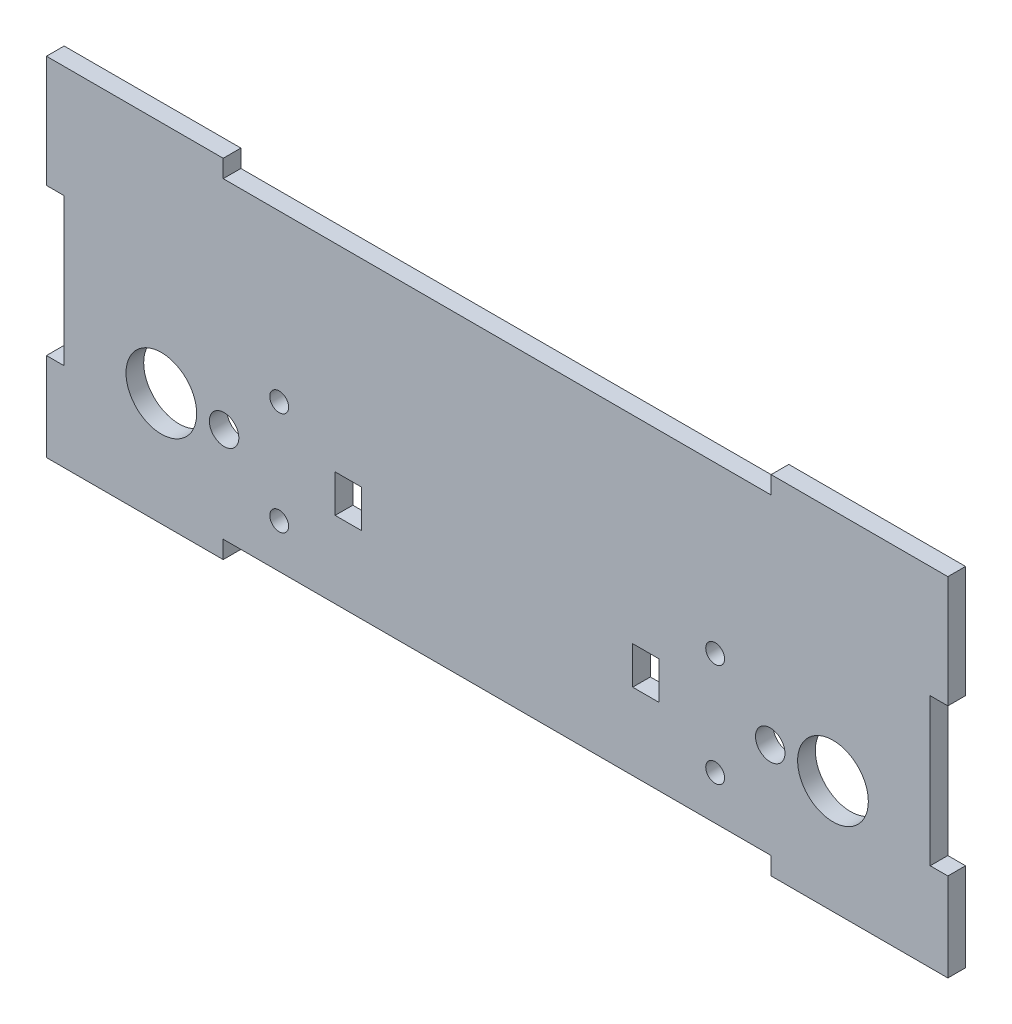
ISO-10303-21;
HEADER;
FILE_DESCRIPTION(('STEP AP214'),'2;1');
FILE_NAME('part.step','',(''),(''),'','','');
FILE_SCHEMA(('AUTOMOTIVE_DESIGN { 1 0 10303 214 1 1 1 1 }'));
ENDSEC;
DATA;
#1=APPLICATION_CONTEXT('core data for automotive mechanical design processes');
#2=APPLICATION_PROTOCOL_DEFINITION('international standard','automotive_design',2000,#1);
#3=PRODUCT_CONTEXT('',#1,'mechanical');
#4=PRODUCT('Part','Part','',(#3));
#5=PRODUCT_RELATED_PRODUCT_CATEGORY('part','',(#4));
#6=PRODUCT_DEFINITION_FORMATION('','',#4);
#7=PRODUCT_DEFINITION_CONTEXT('part definition',#1,'design');
#8=PRODUCT_DEFINITION('design','',#6,#7);
#9=PRODUCT_DEFINITION_SHAPE('','',#8);
#10=(LENGTH_UNIT() NAMED_UNIT(*) SI_UNIT(.MILLI.,.METRE.));
#11=(NAMED_UNIT(*) PLANE_ANGLE_UNIT() SI_UNIT($,.RADIAN.));
#12=(NAMED_UNIT(*) SI_UNIT($,.STERADIAN.) SOLID_ANGLE_UNIT());
#13=UNCERTAINTY_MEASURE_WITH_UNIT(LENGTH_MEASURE(1.E-05),#10,'distance_accuracy_value','');
#14=(GEOMETRIC_REPRESENTATION_CONTEXT(3) GLOBAL_UNCERTAINTY_ASSIGNED_CONTEXT((#13)) GLOBAL_UNIT_ASSIGNED_CONTEXT((#10,
#11,#12)) REPRESENTATION_CONTEXT('',''));
#15=CARTESIAN_POINT('',(0.,0.,0.));
#16=DIRECTION('',(0.,0.,1.));
#17=DIRECTION('',(1.,0.,0.));
#18=AXIS2_PLACEMENT_3D('',#15,#16,#17);
#19=CARTESIAN_POINT('',(0.,0.,3.));
#20=DIRECTION('',(0.,0.,-1.));
#21=DIRECTION('',(-1.,0.,0.));
#22=AXIS2_PLACEMENT_3D('',#19,#20,#21);
#23=PLANE('',#22);
#24=CARTESIAN_POINT('',(-37.,-19.05,3.));
#25=DIRECTION('',(0.,0.,-1.));
#26=DIRECTION('',(-1.,0.,0.));
#27=AXIS2_PLACEMENT_3D('',#24,#25,#26);
#28=CIRCLE('',#27,1.6);
#29=CARTESIAN_POINT('',(-38.6,-19.05,3.));
#30=VERTEX_POINT('',#29);
#31=EDGE_CURVE('E292',#30,#30,#28,.T.);
#32=ORIENTED_EDGE('',*,*,#31,.T.);
#33=EDGE_LOOP('',(#32));
#34=FACE_BOUND('',#33,.T.);
#35=CARTESIAN_POINT('',(37.,-19.05,3.));
#36=DIRECTION('',(0.,0.,-1.));
#37=DIRECTION('',(-1.,0.,0.));
#38=AXIS2_PLACEMENT_3D('',#35,#36,#37);
#39=CIRCLE('',#38,1.6);
#40=CARTESIAN_POINT('',(35.4,-19.05,3.));
#41=VERTEX_POINT('',#40);
#42=EDGE_CURVE('E298',#41,#41,#39,.T.);
#43=ORIENTED_EDGE('',*,*,#42,.T.);
#44=EDGE_LOOP('',(#43));
#45=FACE_BOUND('',#44,.T.);
#46=CARTESIAN_POINT('',(37.,-1.55,3.));
#47=DIRECTION('',(0.,0.,-1.));
#48=DIRECTION('',(-1.,0.,0.));
#49=AXIS2_PLACEMENT_3D('',#46,#47,#48);
#50=CIRCLE('',#49,1.6);
#51=CARTESIAN_POINT('',(35.4,-1.55,3.));
#52=VERTEX_POINT('',#51);
#53=EDGE_CURVE('E304',#52,#52,#50,.T.);
#54=ORIENTED_EDGE('',*,*,#53,.T.);
#55=EDGE_LOOP('',(#54));
#56=FACE_BOUND('',#55,.T.);
#57=CARTESIAN_POINT('',(-46.35,-10.3,3.));
#58=DIRECTION('',(0.,0.,-1.));
#59=DIRECTION('',(-1.,0.,0.));
#60=AXIS2_PLACEMENT_3D('',#57,#58,#59);
#61=CIRCLE('',#60,2.5);
#62=CARTESIAN_POINT('',(-48.85,-10.3,3.));
#63=VERTEX_POINT('',#62);
#64=EDGE_CURVE('E310',#63,#63,#61,.T.);
#65=ORIENTED_EDGE('',*,*,#64,.T.);
#66=EDGE_LOOP('',(#65));
#67=FACE_BOUND('',#66,.T.);
#68=CARTESIAN_POINT('',(46.35,-10.3,3.));
#69=DIRECTION('',(0.,0.,-1.));
#70=DIRECTION('',(-1.,0.,0.));
#71=AXIS2_PLACEMENT_3D('',#68,#69,#70);
#72=CIRCLE('',#71,2.5);
#73=CARTESIAN_POINT('',(43.85,-10.3,3.));
#74=VERTEX_POINT('',#73);
#75=EDGE_CURVE('E251',#74,#74,#72,.T.);
#76=ORIENTED_EDGE('',*,*,#75,.T.);
#77=EDGE_LOOP('',(#76));
#78=FACE_BOUND('',#77,.T.);
#79=DIRECTION('',(0.,1.,0.));
#80=VECTOR('',#79,1.);
#81=CARTESIAN_POINT('',(-23.,0.,3.));
#82=LINE('',#81,#80);
#83=CARTESIAN_POINT('',(-23.,-13.5,3.));
#84=VERTEX_POINT('',#83);
#85=CARTESIAN_POINT('',(-23.,-7.09999999999999,3.));
#86=VERTEX_POINT('',#85);
#87=EDGE_CURVE('E272',#84,#86,#82,.T.);
#88=ORIENTED_EDGE('',*,*,#87,.F.);
#89=DIRECTION('',(1.,0.,0.));
#90=VECTOR('',#89,1.);
#91=CARTESIAN_POINT('',(0.,-13.5,3.));
#92=LINE('',#91,#90);
#93=CARTESIAN_POINT('',(-27.5,-13.5,3.));
#94=VERTEX_POINT('',#93);
#95=EDGE_CURVE('E267',#94,#84,#92,.T.);
#96=ORIENTED_EDGE('',*,*,#95,.F.);
#97=DIRECTION('',(0.,-1.,0.));
#98=VECTOR('',#97,1.);
#99=CARTESIAN_POINT('',(-27.5,0.,3.));
#100=LINE('',#99,#98);
#101=CARTESIAN_POINT('',(-27.5,-7.09999999999999,3.));
#102=VERTEX_POINT('',#101);
#103=EDGE_CURVE('E283',#102,#94,#100,.T.);
#104=ORIENTED_EDGE('',*,*,#103,.F.);
#105=DIRECTION('',(-1.,0.,0.));
#106=VECTOR('',#105,1.);
#107=CARTESIAN_POINT('',(0.,-7.09999999999999,3.));
#108=LINE('',#107,#106);
#109=EDGE_CURVE('E285',#86,#102,#108,.T.);
#110=ORIENTED_EDGE('',*,*,#109,.F.);
#111=EDGE_LOOP('',(#88,#96,#104,#110));
#112=FACE_BOUND('',#111,.T.);
#113=CARTESIAN_POINT('',(-37.,-1.55,3.));
#114=DIRECTION('',(0.,0.,-1.));
#115=DIRECTION('',(-1.,0.,0.));
#116=AXIS2_PLACEMENT_3D('',#113,#114,#115);
#117=CIRCLE('',#116,1.6);
#118=CARTESIAN_POINT('',(-38.6,-1.55,3.));
#119=VERTEX_POINT('',#118);
#120=EDGE_CURVE('E314',#119,#119,#117,.T.);
#121=ORIENTED_EDGE('',*,*,#120,.T.);
#122=EDGE_LOOP('',(#121));
#123=FACE_BOUND('',#122,.T.);
#124=CARTESIAN_POINT('',(-57.,-10.3,3.));
#125=DIRECTION('',(0.,0.,-1.));
#126=DIRECTION('',(-1.,0.,0.));
#127=AXIS2_PLACEMENT_3D('',#124,#125,#126);
#128=CIRCLE('',#127,6.);
#129=CARTESIAN_POINT('',(-63.,-10.3,3.));
#130=VERTEX_POINT('',#129);
#131=EDGE_CURVE('E320',#130,#130,#128,.T.);
#132=ORIENTED_EDGE('',*,*,#131,.T.);
#133=EDGE_LOOP('',(#132));
#134=FACE_BOUND('',#133,.T.);
#135=CARTESIAN_POINT('',(57.,-10.3,3.));
#136=DIRECTION('',(0.,0.,-1.));
#137=DIRECTION('',(1.,0.,0.));
#138=AXIS2_PLACEMENT_3D('',#135,#136,#137);
#139=CIRCLE('',#138,6.);
#140=CARTESIAN_POINT('',(63.,-10.3,3.));
#141=VERTEX_POINT('',#140);
#142=EDGE_CURVE('E317',#141,#141,#139,.T.);
#143=ORIENTED_EDGE('',*,*,#142,.T.);
#144=EDGE_LOOP('',(#143));
#145=FACE_BOUND('',#144,.T.);
#146=DIRECTION('',(0.,-1.,0.));
#147=VECTOR('',#146,1.);
#148=CARTESIAN_POINT('',(-76.5,-29.5,3.));
#149=LINE('',#148,#147);
#150=CARTESIAN_POINT('',(-76.5,29.5,3.));
#151=VERTEX_POINT('',#150);
#152=CARTESIAN_POINT('',(-76.5,10.5,3.));
#153=VERTEX_POINT('',#152);
#154=EDGE_CURVE('E444',#151,#153,#149,.T.);
#155=ORIENTED_EDGE('',*,*,#154,.T.);
#156=DIRECTION('',(-1.,0.,0.));
#157=VECTOR('',#156,1.);
#158=CARTESIAN_POINT('',(-76.5,10.5,3.));
#159=LINE('',#158,#157);
#160=CARTESIAN_POINT('',(-73.5,10.5,3.));
#161=VERTEX_POINT('',#160);
#162=EDGE_CURVE('E336',#161,#153,#159,.T.);
#163=ORIENTED_EDGE('',*,*,#162,.F.);
#164=DIRECTION('',(0.,1.,0.));
#165=VECTOR('',#164,1.);
#166=CARTESIAN_POINT('',(-73.5,10.5,3.));
#167=LINE('',#166,#165);
#168=CARTESIAN_POINT('',(-73.5,-14.5,3.));
#169=VERTEX_POINT('',#168);
#170=EDGE_CURVE('E346',#169,#161,#167,.T.);
#171=ORIENTED_EDGE('',*,*,#170,.F.);
#172=DIRECTION('',(1.,0.,0.));
#173=VECTOR('',#172,1.);
#174=CARTESIAN_POINT('',(-76.5,-14.5,3.));
#175=LINE('',#174,#173);
#176=CARTESIAN_POINT('',(-76.5,-14.5,3.));
#177=VERTEX_POINT('',#176);
#178=EDGE_CURVE('E343',#177,#169,#175,.T.);
#179=ORIENTED_EDGE('',*,*,#178,.F.);
#180=CARTESIAN_POINT('',(-76.5,-29.5,3.));
#181=VERTEX_POINT('',#180);
#182=EDGE_CURVE('E443',#177,#181,#149,.T.);
#183=ORIENTED_EDGE('',*,*,#182,.T.);
#184=DIRECTION('',(1.,0.,0.));
#185=VECTOR('',#184,1.);
#186=CARTESIAN_POINT('',(-76.5,-29.5,3.));
#187=LINE('',#186,#185);
#188=CARTESIAN_POINT('',(-46.5,-29.5,3.));
#189=VERTEX_POINT('',#188);
#190=EDGE_CURVE('E448',#181,#189,#187,.T.);
#191=ORIENTED_EDGE('',*,*,#190,.T.);
#192=DIRECTION('',(0.,1.,0.));
#193=VECTOR('',#192,1.);
#194=CARTESIAN_POINT('',(-46.5,0.,3.));
#195=LINE('',#194,#193);
#196=CARTESIAN_POINT('',(-46.5,-26.5,3.));
#197=VERTEX_POINT('',#196);
#198=EDGE_CURVE('E423',#189,#197,#195,.T.);
#199=ORIENTED_EDGE('',*,*,#198,.T.);
#200=DIRECTION('',(1.,0.,0.));
#201=VECTOR('',#200,1.);
#202=CARTESIAN_POINT('',(0.,-26.5,3.));
#203=LINE('',#202,#201);
#204=CARTESIAN_POINT('',(46.5,-26.5,3.));
#205=VERTEX_POINT('',#204);
#206=EDGE_CURVE('E354',#197,#205,#203,.T.);
#207=ORIENTED_EDGE('',*,*,#206,.T.);
#208=DIRECTION('',(0.,1.,0.));
#209=VECTOR('',#208,1.);
#210=CARTESIAN_POINT('',(46.5,0.,3.));
#211=LINE('',#210,#209);
#212=CARTESIAN_POINT('',(46.5,-29.5,3.));
#213=VERTEX_POINT('',#212);
#214=EDGE_CURVE('E415',#213,#205,#211,.T.);
#215=ORIENTED_EDGE('',*,*,#214,.F.);
#216=CARTESIAN_POINT('',(76.5,-29.5,3.));
#217=VERTEX_POINT('',#216);
#218=EDGE_CURVE('E447',#213,#217,#187,.T.);
#219=ORIENTED_EDGE('',*,*,#218,.T.);
#220=DIRECTION('',(0.,1.,0.));
#221=VECTOR('',#220,1.);
#222=CARTESIAN_POINT('',(76.5,-29.5,3.));
#223=LINE('',#222,#221);
#224=CARTESIAN_POINT('',(76.5,-14.5,3.));
#225=VERTEX_POINT('',#224);
#226=EDGE_CURVE('E435',#217,#225,#223,.T.);
#227=ORIENTED_EDGE('',*,*,#226,.T.);
#228=DIRECTION('',(1.,0.,0.));
#229=VECTOR('',#228,1.);
#230=CARTESIAN_POINT('',(76.5,-14.5,3.));
#231=LINE('',#230,#229);
#232=CARTESIAN_POINT('',(73.5,-14.5,3.));
#233=VERTEX_POINT('',#232);
#234=EDGE_CURVE('E369',#233,#225,#231,.T.);
#235=ORIENTED_EDGE('',*,*,#234,.F.);
#236=DIRECTION('',(0.,-1.,0.));
#237=VECTOR('',#236,1.);
#238=CARTESIAN_POINT('',(73.5,10.5,3.));
#239=LINE('',#238,#237);
#240=CARTESIAN_POINT('',(73.5,10.5,3.));
#241=VERTEX_POINT('',#240);
#242=EDGE_CURVE('E371',#241,#233,#239,.T.);
#243=ORIENTED_EDGE('',*,*,#242,.F.);
#244=DIRECTION('',(-1.,0.,0.));
#245=VECTOR('',#244,1.);
#246=CARTESIAN_POINT('',(76.5,10.5,3.));
#247=LINE('',#246,#245);
#248=CARTESIAN_POINT('',(76.5,10.5,3.));
#249=VERTEX_POINT('',#248);
#250=EDGE_CURVE('E347',#249,#241,#247,.T.);
#251=ORIENTED_EDGE('',*,*,#250,.F.);
#252=CARTESIAN_POINT('',(76.5,29.5,3.));
#253=VERTEX_POINT('',#252);
#254=EDGE_CURVE('E439',#249,#253,#223,.T.);
#255=ORIENTED_EDGE('',*,*,#254,.T.);
#256=DIRECTION('',(-1.,0.,0.));
#257=VECTOR('',#256,1.);
#258=CARTESIAN_POINT('',(-76.5,29.5,3.));
#259=LINE('',#258,#257);
#260=CARTESIAN_POINT('',(46.5,29.5,3.));
#261=VERTEX_POINT('',#260);
#262=EDGE_CURVE('E440',#253,#261,#259,.T.);
#263=ORIENTED_EDGE('',*,*,#262,.T.);
#264=DIRECTION('',(0.,-1.,0.));
#265=VECTOR('',#264,1.);
#266=CARTESIAN_POINT('',(46.5,0.,3.));
#267=LINE('',#266,#265);
#268=CARTESIAN_POINT('',(46.5,26.5,3.));
#269=VERTEX_POINT('',#268);
#270=EDGE_CURVE('E394',#261,#269,#267,.T.);
#271=ORIENTED_EDGE('',*,*,#270,.T.);
#272=DIRECTION('',(1.,0.,0.));
#273=VECTOR('',#272,1.);
#274=CARTESIAN_POINT('',(0.,26.5,3.));
#275=LINE('',#274,#273);
#276=CARTESIAN_POINT('',(-46.5,26.5,3.));
#277=VERTEX_POINT('',#276);
#278=EDGE_CURVE('E387',#277,#269,#275,.T.);
#279=ORIENTED_EDGE('',*,*,#278,.F.);
#280=DIRECTION('',(0.,-1.,0.));
#281=VECTOR('',#280,1.);
#282=CARTESIAN_POINT('',(-46.5,0.,3.));
#283=LINE('',#282,#281);
#284=CARTESIAN_POINT('',(-46.5,29.5,3.));
#285=VERTEX_POINT('',#284);
#286=EDGE_CURVE('E397',#285,#277,#283,.T.);
#287=ORIENTED_EDGE('',*,*,#286,.F.);
#288=EDGE_CURVE('E438',#285,#151,#259,.T.);
#289=ORIENTED_EDGE('',*,*,#288,.T.);
#290=EDGE_LOOP('',(#155,#163,#171,#179,#183,#191,#199,#207,#215,#219,#227,#235,#243,#251,#255,
#263,#271,#279,#287,#289));
#291=FACE_BOUND('',#290,.T.);
#292=DIRECTION('',(0.,-1.,0.));
#293=VECTOR('',#292,1.);
#294=CARTESIAN_POINT('',(23.,0.,3.));
#295=LINE('',#294,#293);
#296=CARTESIAN_POINT('',(23.,-7.09999999999999,3.));
#297=VERTEX_POINT('',#296);
#298=CARTESIAN_POINT('',(23.,-13.5,3.));
#299=VERTEX_POINT('',#298);
#300=EDGE_CURVE('E241',#297,#299,#295,.T.);
#301=ORIENTED_EDGE('',*,*,#300,.F.);
#302=DIRECTION('',(-1.,0.,0.));
#303=VECTOR('',#302,1.);
#304=CARTESIAN_POINT('',(0.,-7.09999999999999,3.));
#305=LINE('',#304,#303);
#306=CARTESIAN_POINT('',(27.5,-7.09999999999999,3.));
#307=VERTEX_POINT('',#306);
#308=EDGE_CURVE('E252',#307,#297,#305,.T.);
#309=ORIENTED_EDGE('',*,*,#308,.F.);
#310=DIRECTION('',(0.,1.,0.));
#311=VECTOR('',#310,1.);
#312=CARTESIAN_POINT('',(27.5,0.,3.));
#313=LINE('',#312,#311);
#314=CARTESIAN_POINT('',(27.5,-13.5,3.));
#315=VERTEX_POINT('',#314);
#316=EDGE_CURVE('E229',#315,#307,#313,.T.);
#317=ORIENTED_EDGE('',*,*,#316,.F.);
#318=DIRECTION('',(1.,0.,0.));
#319=VECTOR('',#318,1.);
#320=CARTESIAN_POINT('',(0.,-13.5,3.));
#321=LINE('',#320,#319);
#322=EDGE_CURVE('E255',#299,#315,#321,.T.);
#323=ORIENTED_EDGE('',*,*,#322,.F.);
#324=EDGE_LOOP('',(#301,#309,#317,#323));
#325=FACE_BOUND('',#324,.T.);
#326=ADVANCED_FACE('F39',(#34,#45,#56,#67,#78,#112,#123,#134,#145,#291,#325),#23,.F.);
#327=CARTESIAN_POINT('',(0.,0.,0.));
#328=DIRECTION('',(0.,0.,-1.));
#329=DIRECTION('',(-1.,0.,0.));
#330=AXIS2_PLACEMENT_3D('',#327,#328,#329);
#331=PLANE('',#330);
#332=CARTESIAN_POINT('',(-37.,-19.05,0.));
#333=DIRECTION('',(0.,0.,-1.));
#334=DIRECTION('',(-1.,0.,0.));
#335=AXIS2_PLACEMENT_3D('',#332,#333,#334);
#336=CIRCLE('',#335,1.6);
#337=CARTESIAN_POINT('',(-38.6,-19.05,0.));
#338=VERTEX_POINT('',#337);
#339=EDGE_CURVE('E288',#338,#338,#336,.T.);
#340=ORIENTED_EDGE('',*,*,#339,.F.);
#341=EDGE_LOOP('',(#340));
#342=FACE_BOUND('',#341,.T.);
#343=CARTESIAN_POINT('',(37.,-19.05,0.));
#344=DIRECTION('',(0.,0.,-1.));
#345=DIRECTION('',(-1.,0.,0.));
#346=AXIS2_PLACEMENT_3D('',#343,#344,#345);
#347=CIRCLE('',#346,1.6);
#348=CARTESIAN_POINT('',(35.4,-19.05,0.));
#349=VERTEX_POINT('',#348);
#350=EDGE_CURVE('E295',#349,#349,#347,.T.);
#351=ORIENTED_EDGE('',*,*,#350,.F.);
#352=EDGE_LOOP('',(#351));
#353=FACE_BOUND('',#352,.T.);
#354=CARTESIAN_POINT('',(37.,-1.55,0.));
#355=DIRECTION('',(0.,0.,-1.));
#356=DIRECTION('',(-1.,0.,0.));
#357=AXIS2_PLACEMENT_3D('',#354,#355,#356);
#358=CIRCLE('',#357,1.6);
#359=CARTESIAN_POINT('',(35.4,-1.55,0.));
#360=VERTEX_POINT('',#359);
#361=EDGE_CURVE('E301',#360,#360,#358,.T.);
#362=ORIENTED_EDGE('',*,*,#361,.F.);
#363=EDGE_LOOP('',(#362));
#364=FACE_BOUND('',#363,.T.);
#365=CARTESIAN_POINT('',(-46.35,-10.3,0.));
#366=DIRECTION('',(0.,0.,-1.));
#367=DIRECTION('',(-1.,0.,0.));
#368=AXIS2_PLACEMENT_3D('',#365,#366,#367);
#369=CIRCLE('',#368,2.5);
#370=CARTESIAN_POINT('',(-48.85,-10.3,0.));
#371=VERTEX_POINT('',#370);
#372=EDGE_CURVE('E307',#371,#371,#369,.T.);
#373=ORIENTED_EDGE('',*,*,#372,.F.);
#374=EDGE_LOOP('',(#373));
#375=FACE_BOUND('',#374,.T.);
#376=CARTESIAN_POINT('',(46.35,-10.3,0.));
#377=DIRECTION('',(0.,0.,-1.));
#378=DIRECTION('',(-1.,0.,0.));
#379=AXIS2_PLACEMENT_3D('',#376,#377,#378);
#380=CIRCLE('',#379,2.5);
#381=CARTESIAN_POINT('',(43.85,-10.3,0.));
#382=VERTEX_POINT('',#381);
#383=EDGE_CURVE('E313',#382,#382,#380,.T.);
#384=ORIENTED_EDGE('',*,*,#383,.F.);
#385=EDGE_LOOP('',(#384));
#386=FACE_BOUND('',#385,.T.);
#387=CARTESIAN_POINT('',(-37.,-1.55,0.));
#388=DIRECTION('',(0.,0.,-1.));
#389=DIRECTION('',(-1.,0.,0.));
#390=AXIS2_PLACEMENT_3D('',#387,#388,#389);
#391=CIRCLE('',#390,1.6);
#392=CARTESIAN_POINT('',(-38.6,-1.55,0.));
#393=VERTEX_POINT('',#392);
#394=EDGE_CURVE('E291',#393,#393,#391,.T.);
#395=ORIENTED_EDGE('',*,*,#394,.F.);
#396=EDGE_LOOP('',(#395));
#397=FACE_BOUND('',#396,.T.);
#398=CARTESIAN_POINT('',(-57.,-10.3,0.));
#399=DIRECTION('',(0.,0.,-1.));
#400=DIRECTION('',(-1.,0.,0.));
#401=AXIS2_PLACEMENT_3D('',#398,#399,#400);
#402=CIRCLE('',#401,6.);
#403=CARTESIAN_POINT('',(-63.,-10.3,0.));
#404=VERTEX_POINT('',#403);
#405=EDGE_CURVE('E324',#404,#404,#402,.T.);
#406=ORIENTED_EDGE('',*,*,#405,.F.);
#407=EDGE_LOOP('',(#406));
#408=FACE_BOUND('',#407,.T.);
#409=CARTESIAN_POINT('',(57.,-10.3,0.));
#410=DIRECTION('',(0.,0.,-1.));
#411=DIRECTION('',(1.,0.,0.));
#412=AXIS2_PLACEMENT_3D('',#409,#410,#411);
#413=CIRCLE('',#412,6.);
#414=CARTESIAN_POINT('',(63.,-10.3,0.));
#415=VERTEX_POINT('',#414);
#416=EDGE_CURVE('E327',#415,#415,#413,.T.);
#417=ORIENTED_EDGE('',*,*,#416,.F.);
#418=EDGE_LOOP('',(#417));
#419=FACE_BOUND('',#418,.T.);
#420=DIRECTION('',(-1.,0.,0.));
#421=VECTOR('',#420,1.);
#422=CARTESIAN_POINT('',(-76.5,10.5,0.));
#423=LINE('',#422,#421);
#424=CARTESIAN_POINT('',(-73.5,10.5,0.));
#425=VERTEX_POINT('',#424);
#426=CARTESIAN_POINT('',(-76.5,10.5,0.));
#427=VERTEX_POINT('',#426);
#428=EDGE_CURVE('E339',#425,#427,#423,.T.);
#429=ORIENTED_EDGE('',*,*,#428,.T.);
#430=DIRECTION('',(0.,-1.,0.));
#431=VECTOR('',#430,1.);
#432=CARTESIAN_POINT('',(-76.5,-29.5,0.));
#433=LINE('',#432,#431);
#434=CARTESIAN_POINT('',(-76.5,29.5,0.));
#435=VERTEX_POINT('',#434);
#436=EDGE_CURVE('E460',#435,#427,#433,.T.);
#437=ORIENTED_EDGE('',*,*,#436,.F.);
#438=DIRECTION('',(-1.,0.,0.));
#439=VECTOR('',#438,1.);
#440=CARTESIAN_POINT('',(-76.5,29.5,0.));
#441=LINE('',#440,#439);
#442=CARTESIAN_POINT('',(-46.5,29.5,0.));
#443=VERTEX_POINT('',#442);
#444=EDGE_CURVE('E455',#443,#435,#441,.T.);
#445=ORIENTED_EDGE('',*,*,#444,.F.);
#446=DIRECTION('',(0.,-1.,0.));
#447=VECTOR('',#446,1.);
#448=CARTESIAN_POINT('',(-46.5,0.,0.));
#449=LINE('',#448,#447);
#450=CARTESIAN_POINT('',(-46.5,26.5,0.));
#451=VERTEX_POINT('',#450);
#452=EDGE_CURVE('E386',#443,#451,#449,.T.);
#453=ORIENTED_EDGE('',*,*,#452,.T.);
#454=DIRECTION('',(1.,0.,0.));
#455=VECTOR('',#454,1.);
#456=CARTESIAN_POINT('',(0.,26.5,0.));
#457=LINE('',#456,#455);
#458=CARTESIAN_POINT('',(46.5,26.5,0.));
#459=VERTEX_POINT('',#458);
#460=EDGE_CURVE('E390',#451,#459,#457,.T.);
#461=ORIENTED_EDGE('',*,*,#460,.T.);
#462=DIRECTION('',(0.,-1.,0.));
#463=VECTOR('',#462,1.);
#464=CARTESIAN_POINT('',(46.5,0.,0.));
#465=LINE('',#464,#463);
#466=CARTESIAN_POINT('',(46.5,29.5,0.));
#467=VERTEX_POINT('',#466);
#468=EDGE_CURVE('E384',#467,#459,#465,.T.);
#469=ORIENTED_EDGE('',*,*,#468,.F.);
#470=CARTESIAN_POINT('',(76.5,29.5,0.));
#471=VERTEX_POINT('',#470);
#472=EDGE_CURVE('E456',#471,#467,#441,.T.);
#473=ORIENTED_EDGE('',*,*,#472,.F.);
#474=DIRECTION('',(0.,1.,0.));
#475=VECTOR('',#474,1.);
#476=CARTESIAN_POINT('',(76.5,-29.5,0.));
#477=LINE('',#476,#475);
#478=CARTESIAN_POINT('',(76.5,10.5,0.));
#479=VERTEX_POINT('',#478);
#480=EDGE_CURVE('E405',#479,#471,#477,.T.);
#481=ORIENTED_EDGE('',*,*,#480,.F.);
#482=DIRECTION('',(-1.,0.,0.));
#483=VECTOR('',#482,1.);
#484=CARTESIAN_POINT('',(76.5,10.5,0.));
#485=LINE('',#484,#483);
#486=CARTESIAN_POINT('',(73.5,10.5,0.));
#487=VERTEX_POINT('',#486);
#488=EDGE_CURVE('E372',#479,#487,#485,.T.);
#489=ORIENTED_EDGE('',*,*,#488,.T.);
#490=DIRECTION('',(0.,-1.,0.));
#491=VECTOR('',#490,1.);
#492=CARTESIAN_POINT('',(73.5,10.5,0.));
#493=LINE('',#492,#491);
#494=CARTESIAN_POINT('',(73.5,-14.5,0.));
#495=VERTEX_POINT('',#494);
#496=EDGE_CURVE('E379',#487,#495,#493,.T.);
#497=ORIENTED_EDGE('',*,*,#496,.T.);
#498=DIRECTION('',(1.,0.,0.));
#499=VECTOR('',#498,1.);
#500=CARTESIAN_POINT('',(76.5,-14.5,0.));
#501=LINE('',#500,#499);
#502=CARTESIAN_POINT('',(76.5,-14.5,0.));
#503=VERTEX_POINT('',#502);
#504=EDGE_CURVE('E362',#495,#503,#501,.T.);
#505=ORIENTED_EDGE('',*,*,#504,.T.);
#506=CARTESIAN_POINT('',(76.5,-29.5,0.));
#507=VERTEX_POINT('',#506);
#508=EDGE_CURVE('E452',#507,#503,#477,.T.);
#509=ORIENTED_EDGE('',*,*,#508,.F.);
#510=DIRECTION('',(1.,0.,0.));
#511=VECTOR('',#510,1.);
#512=CARTESIAN_POINT('',(-76.5,-29.5,0.));
#513=LINE('',#512,#511);
#514=CARTESIAN_POINT('',(46.5,-29.5,0.));
#515=VERTEX_POINT('',#514);
#516=EDGE_CURVE('E463',#515,#507,#513,.T.);
#517=ORIENTED_EDGE('',*,*,#516,.F.);
#518=DIRECTION('',(0.,1.,0.));
#519=VECTOR('',#518,1.);
#520=CARTESIAN_POINT('',(46.5,0.,0.));
#521=LINE('',#520,#519);
#522=CARTESIAN_POINT('',(46.5,-26.5,0.));
#523=VERTEX_POINT('',#522);
#524=EDGE_CURVE('E417',#515,#523,#521,.T.);
#525=ORIENTED_EDGE('',*,*,#524,.T.);
#526=DIRECTION('',(1.,0.,0.));
#527=VECTOR('',#526,1.);
#528=CARTESIAN_POINT('',(0.,-26.5,0.));
#529=LINE('',#528,#527);
#530=CARTESIAN_POINT('',(-46.5,-26.5,0.));
#531=VERTEX_POINT('',#530);
#532=EDGE_CURVE('E412',#531,#523,#529,.T.);
#533=ORIENTED_EDGE('',*,*,#532,.F.);
#534=DIRECTION('',(0.,1.,0.));
#535=VECTOR('',#534,1.);
#536=CARTESIAN_POINT('',(-46.5,0.,0.));
#537=LINE('',#536,#535);
#538=CARTESIAN_POINT('',(-46.5,-29.5,0.));
#539=VERTEX_POINT('',#538);
#540=EDGE_CURVE('E414',#539,#531,#537,.T.);
#541=ORIENTED_EDGE('',*,*,#540,.F.);
#542=CARTESIAN_POINT('',(-76.5,-29.5,0.));
#543=VERTEX_POINT('',#542);
#544=EDGE_CURVE('E464',#543,#539,#513,.T.);
#545=ORIENTED_EDGE('',*,*,#544,.F.);
#546=CARTESIAN_POINT('',(-76.5,-14.5,0.));
#547=VERTEX_POINT('',#546);
#548=EDGE_CURVE('E459',#547,#543,#433,.T.);
#549=ORIENTED_EDGE('',*,*,#548,.F.);
#550=DIRECTION('',(1.,0.,0.));
#551=VECTOR('',#550,1.);
#552=CARTESIAN_POINT('',(-76.5,-14.5,0.));
#553=LINE('',#552,#551);
#554=CARTESIAN_POINT('',(-73.5,-14.5,0.));
#555=VERTEX_POINT('',#554);
#556=EDGE_CURVE('E332',#547,#555,#553,.T.);
#557=ORIENTED_EDGE('',*,*,#556,.T.);
#558=DIRECTION('',(0.,1.,0.));
#559=VECTOR('',#558,1.);
#560=CARTESIAN_POINT('',(-73.5,10.5,0.));
#561=LINE('',#560,#559);
#562=EDGE_CURVE('E335',#555,#425,#561,.T.);
#563=ORIENTED_EDGE('',*,*,#562,.T.);
#564=EDGE_LOOP('',(#429,#437,#445,#453,#461,#469,#473,#481,#489,#497,#505,#509,#517,#525,#533,
#541,#545,#549,#557,#563));
#565=FACE_BOUND('',#564,.T.);
#566=DIRECTION('',(1.,0.,0.));
#567=VECTOR('',#566,1.);
#568=CARTESIAN_POINT('',(0.,-13.5,0.));
#569=LINE('',#568,#567);
#570=CARTESIAN_POINT('',(-27.5,-13.5,0.));
#571=VERTEX_POINT('',#570);
#572=CARTESIAN_POINT('',(-23.,-13.5,0.));
#573=VERTEX_POINT('',#572);
#574=EDGE_CURVE('E268',#571,#573,#569,.T.);
#575=ORIENTED_EDGE('',*,*,#574,.T.);
#576=DIRECTION('',(0.,1.,0.));
#577=VECTOR('',#576,1.);
#578=CARTESIAN_POINT('',(-23.,0.,0.));
#579=LINE('',#578,#577);
#580=CARTESIAN_POINT('',(-23.,-7.09999999999999,0.));
#581=VERTEX_POINT('',#580);
#582=EDGE_CURVE('E278',#573,#581,#579,.T.);
#583=ORIENTED_EDGE('',*,*,#582,.T.);
#584=DIRECTION('',(-1.,0.,0.));
#585=VECTOR('',#584,1.);
#586=CARTESIAN_POINT('',(0.,-7.09999999999999,0.));
#587=LINE('',#586,#585);
#588=CARTESIAN_POINT('',(-27.5,-7.09999999999999,0.));
#589=VERTEX_POINT('',#588);
#590=EDGE_CURVE('E275',#581,#589,#587,.T.);
#591=ORIENTED_EDGE('',*,*,#590,.T.);
#592=DIRECTION('',(0.,-1.,0.));
#593=VECTOR('',#592,1.);
#594=CARTESIAN_POINT('',(-27.5,0.,0.));
#595=LINE('',#594,#593);
#596=EDGE_CURVE('E271',#589,#571,#595,.T.);
#597=ORIENTED_EDGE('',*,*,#596,.T.);
#598=EDGE_LOOP('',(#575,#583,#591,#597));
#599=FACE_BOUND('',#598,.T.);
#600=DIRECTION('',(-1.,0.,0.));
#601=VECTOR('',#600,1.);
#602=CARTESIAN_POINT('',(0.,-7.09999999999999,0.));
#603=LINE('',#602,#601);
#604=CARTESIAN_POINT('',(27.5,-7.09999999999999,0.));
#605=VERTEX_POINT('',#604);
#606=CARTESIAN_POINT('',(23.,-7.09999999999999,0.));
#607=VERTEX_POINT('',#606);
#608=EDGE_CURVE('E236',#605,#607,#603,.T.);
#609=ORIENTED_EDGE('',*,*,#608,.T.);
#610=DIRECTION('',(0.,-1.,0.));
#611=VECTOR('',#610,1.);
#612=CARTESIAN_POINT('',(23.,0.,0.));
#613=LINE('',#612,#611);
#614=CARTESIAN_POINT('',(23.,-13.5,0.));
#615=VERTEX_POINT('',#614);
#616=EDGE_CURVE('E246',#607,#615,#613,.T.);
#617=ORIENTED_EDGE('',*,*,#616,.T.);
#618=DIRECTION('',(1.,0.,0.));
#619=VECTOR('',#618,1.);
#620=CARTESIAN_POINT('',(0.,-13.5,0.));
#621=LINE('',#620,#619);
#622=CARTESIAN_POINT('',(27.5,-13.5,0.));
#623=VERTEX_POINT('',#622);
#624=EDGE_CURVE('E244',#615,#623,#621,.T.);
#625=ORIENTED_EDGE('',*,*,#624,.T.);
#626=DIRECTION('',(0.,1.,0.));
#627=VECTOR('',#626,1.);
#628=CARTESIAN_POINT('',(27.5,0.,0.));
#629=LINE('',#628,#627);
#630=EDGE_CURVE('E226',#623,#605,#629,.T.);
#631=ORIENTED_EDGE('',*,*,#630,.T.);
#632=EDGE_LOOP('',(#609,#617,#625,#631));
#633=FACE_BOUND('',#632,.T.);
#634=ADVANCED_FACE('F243',(#342,#353,#364,#375,#386,#397,#408,#419,#565,#599,#633),#331,.T.);
#635=CARTESIAN_POINT('',(76.5,-29.5,3.));
#636=DIRECTION('',(-1.,0.,0.));
#637=DIRECTION('',(0.,0.,1.));
#638=AXIS2_PLACEMENT_3D('',#635,#636,#637);
#639=PLANE('',#638);
#640=ORIENTED_EDGE('',*,*,#254,.F.);
#641=DIRECTION('',(0.,0.,1.));
#642=VECTOR('',#641,1.);
#643=CARTESIAN_POINT('',(76.5,10.5,0.));
#644=LINE('',#643,#642);
#645=EDGE_CURVE('E323',#479,#249,#644,.T.);
#646=ORIENTED_EDGE('',*,*,#645,.F.);
#647=ORIENTED_EDGE('',*,*,#480,.T.);
#648=DIRECTION('',(0.,0.,-1.));
#649=VECTOR('',#648,1.);
#650=CARTESIAN_POINT('',(76.5,29.5,3.));
#651=LINE('',#650,#649);
#652=EDGE_CURVE('E11',#253,#471,#651,.T.);
#653=ORIENTED_EDGE('',*,*,#652,.F.);
#654=EDGE_LOOP('',(#640,#646,#647,#653));
#655=FACE_BOUND('',#654,.T.);
#656=ADVANCED_FACE('F513',(#655),#639,.F.);
#657=CARTESIAN_POINT('',(-76.5,-29.5,3.));
#658=DIRECTION('',(1.,0.,0.));
#659=DIRECTION('',(0.,0.,-1.));
#660=AXIS2_PLACEMENT_3D('',#657,#658,#659);
#661=PLANE('',#660);
#662=ORIENTED_EDGE('',*,*,#436,.T.);
#663=DIRECTION('',(0.,0.,1.));
#664=VECTOR('',#663,1.);
#665=CARTESIAN_POINT('',(-76.5,10.5,0.));
#666=LINE('',#665,#664);
#667=EDGE_CURVE('E351',#427,#153,#666,.T.);
#668=ORIENTED_EDGE('',*,*,#667,.T.);
#669=ORIENTED_EDGE('',*,*,#154,.F.);
#670=DIRECTION('',(0.,0.,-1.));
#671=VECTOR('',#670,1.);
#672=CARTESIAN_POINT('',(-76.5,29.5,3.));
#673=LINE('',#672,#671);
#674=EDGE_CURVE('E47',#151,#435,#673,.T.);
#675=ORIENTED_EDGE('',*,*,#674,.T.);
#676=EDGE_LOOP('',(#662,#668,#669,#675));
#677=FACE_BOUND('',#676,.T.);
#678=ADVANCED_FACE('F476',(#677),#661,.F.);
#679=CARTESIAN_POINT('',(-76.5,29.5,3.));
#680=DIRECTION('',(0.,-1.,0.));
#681=DIRECTION('',(0.,0.,-1.));
#682=AXIS2_PLACEMENT_3D('',#679,#680,#681);
#683=PLANE('',#682);
#684=DIRECTION('',(0.,0.,1.));
#685=VECTOR('',#684,1.);
#686=CARTESIAN_POINT('',(46.5,29.5,0.));
#687=LINE('',#686,#685);
#688=EDGE_CURVE('E393',#467,#261,#687,.T.);
#689=ORIENTED_EDGE('',*,*,#688,.T.);
#690=ORIENTED_EDGE('',*,*,#262,.F.);
#691=ORIENTED_EDGE('',*,*,#652,.T.);
#692=ORIENTED_EDGE('',*,*,#472,.T.);
#693=EDGE_LOOP('',(#689,#690,#691,#692));
#694=FACE_BOUND('',#693,.T.);
#695=ADVANCED_FACE('F506',(#694),#683,.F.);
#696=CARTESIAN_POINT('',(-76.5,-29.5,3.));
#697=DIRECTION('',(0.,1.,0.));
#698=DIRECTION('',(0.,0.,1.));
#699=AXIS2_PLACEMENT_3D('',#696,#697,#698);
#700=PLANE('',#699);
#701=DIRECTION('',(0.,0.,1.));
#702=VECTOR('',#701,1.);
#703=CARTESIAN_POINT('',(-46.5,-29.5,0.));
#704=LINE('',#703,#702);
#705=EDGE_CURVE('E431',#539,#189,#704,.T.);
#706=ORIENTED_EDGE('',*,*,#705,.T.);
#707=ORIENTED_EDGE('',*,*,#190,.F.);
#708=DIRECTION('',(0.,0.,-1.));
#709=VECTOR('',#708,1.);
#710=CARTESIAN_POINT('',(-76.5,-29.5,3.));
#711=LINE('',#710,#709);
#712=EDGE_CURVE('E469',#181,#543,#711,.T.);
#713=ORIENTED_EDGE('',*,*,#712,.T.);
#714=ORIENTED_EDGE('',*,*,#544,.T.);
#715=EDGE_LOOP('',(#706,#707,#713,#714));
#716=FACE_BOUND('',#715,.T.);
#717=ADVANCED_FACE('F548',(#716),#700,.F.);
#718=ORIENTED_EDGE('',*,*,#508,.T.);
#719=DIRECTION('',(0.,0.,1.));
#720=VECTOR('',#719,1.);
#721=CARTESIAN_POINT('',(76.5,-14.5,0.));
#722=LINE('',#721,#720);
#723=EDGE_CURVE('E365',#503,#225,#722,.T.);
#724=ORIENTED_EDGE('',*,*,#723,.T.);
#725=ORIENTED_EDGE('',*,*,#226,.F.);
#726=DIRECTION('',(0.,0.,-1.));
#727=VECTOR('',#726,1.);
#728=CARTESIAN_POINT('',(76.5,-29.5,3.));
#729=LINE('',#728,#727);
#730=EDGE_CURVE('E451',#217,#507,#729,.T.);
#731=ORIENTED_EDGE('',*,*,#730,.T.);
#732=EDGE_LOOP('',(#718,#724,#725,#731));
#733=FACE_BOUND('',#732,.T.);
#734=ADVANCED_FACE('F41',(#733),#639,.F.);
#735=ORIENTED_EDGE('',*,*,#288,.F.);
#736=DIRECTION('',(0.,0.,1.));
#737=VECTOR('',#736,1.);
#738=CARTESIAN_POINT('',(-46.5,29.5,0.));
#739=LINE('',#738,#737);
#740=EDGE_CURVE('E408',#443,#285,#739,.T.);
#741=ORIENTED_EDGE('',*,*,#740,.F.);
#742=ORIENTED_EDGE('',*,*,#444,.T.);
#743=ORIENTED_EDGE('',*,*,#674,.F.);
#744=EDGE_LOOP('',(#735,#741,#742,#743));
#745=FACE_BOUND('',#744,.T.);
#746=ADVANCED_FACE('F493',(#745),#683,.F.);
#747=ORIENTED_EDGE('',*,*,#182,.F.);
#748=DIRECTION('',(0.,0.,1.));
#749=VECTOR('',#748,1.);
#750=CARTESIAN_POINT('',(-76.5,-14.5,0.));
#751=LINE('',#750,#749);
#752=EDGE_CURVE('E342',#547,#177,#751,.T.);
#753=ORIENTED_EDGE('',*,*,#752,.F.);
#754=ORIENTED_EDGE('',*,*,#548,.T.);
#755=ORIENTED_EDGE('',*,*,#712,.F.);
#756=EDGE_LOOP('',(#747,#753,#754,#755));
#757=FACE_BOUND('',#756,.T.);
#758=ADVANCED_FACE('F553',(#757),#661,.F.);
#759=ORIENTED_EDGE('',*,*,#218,.F.);
#760=DIRECTION('',(0.,0.,1.));
#761=VECTOR('',#760,1.);
#762=CARTESIAN_POINT('',(46.5,-29.5,0.));
#763=LINE('',#762,#761);
#764=EDGE_CURVE('E429',#515,#213,#763,.T.);
#765=ORIENTED_EDGE('',*,*,#764,.F.);
#766=ORIENTED_EDGE('',*,*,#516,.T.);
#767=ORIENTED_EDGE('',*,*,#730,.F.);
#768=EDGE_LOOP('',(#759,#765,#766,#767));
#769=FACE_BOUND('',#768,.T.);
#770=ADVANCED_FACE('F531',(#769),#700,.F.);
#771=CARTESIAN_POINT('',(0.,-26.5,0.));
#772=DIRECTION('',(0.,-1.,0.));
#773=DIRECTION('',(1.,0.,0.));
#774=AXIS2_PLACEMENT_3D('',#771,#772,#773);
#775=PLANE('',#774);
#776=ORIENTED_EDGE('',*,*,#206,.F.);
#777=DIRECTION('',(0.,0.,1.));
#778=VECTOR('',#777,1.);
#779=CARTESIAN_POINT('',(-46.5,-26.5,0.));
#780=LINE('',#779,#778);
#781=EDGE_CURVE('E420',#531,#197,#780,.T.);
#782=ORIENTED_EDGE('',*,*,#781,.F.);
#783=ORIENTED_EDGE('',*,*,#532,.T.);
#784=DIRECTION('',(0.,0.,1.));
#785=VECTOR('',#784,1.);
#786=CARTESIAN_POINT('',(46.5,-26.5,0.));
#787=LINE('',#786,#785);
#788=EDGE_CURVE('E398',#523,#205,#787,.T.);
#789=ORIENTED_EDGE('',*,*,#788,.T.);
#790=EDGE_LOOP('',(#776,#782,#783,#789));
#791=FACE_BOUND('',#790,.T.);
#792=ADVANCED_FACE('F541',(#791),#775,.T.);
#793=CARTESIAN_POINT('',(46.5,0.,0.));
#794=DIRECTION('',(1.,0.,0.));
#795=DIRECTION('',(0.,0.,-1.));
#796=AXIS2_PLACEMENT_3D('',#793,#794,#795);
#797=PLANE('',#796);
#798=ORIENTED_EDGE('',*,*,#214,.T.);
#799=ORIENTED_EDGE('',*,*,#788,.F.);
#800=ORIENTED_EDGE('',*,*,#524,.F.);
#801=ORIENTED_EDGE('',*,*,#764,.T.);
#802=EDGE_LOOP('',(#798,#799,#800,#801));
#803=FACE_BOUND('',#802,.T.);
#804=ADVANCED_FACE('F537',(#803),#797,.F.);
#805=CARTESIAN_POINT('',(-46.5,0.,0.));
#806=DIRECTION('',(1.,0.,0.));
#807=DIRECTION('',(0.,0.,-1.));
#808=AXIS2_PLACEMENT_3D('',#805,#806,#807);
#809=PLANE('',#808);
#810=ORIENTED_EDGE('',*,*,#198,.F.);
#811=ORIENTED_EDGE('',*,*,#705,.F.);
#812=ORIENTED_EDGE('',*,*,#540,.T.);
#813=ORIENTED_EDGE('',*,*,#781,.T.);
#814=EDGE_LOOP('',(#810,#811,#812,#813));
#815=FACE_BOUND('',#814,.T.);
#816=ADVANCED_FACE('F544',(#815),#809,.T.);
#817=CARTESIAN_POINT('',(46.5,0.,0.));
#818=DIRECTION('',(-1.,0.,0.));
#819=DIRECTION('',(0.,0.,1.));
#820=AXIS2_PLACEMENT_3D('',#817,#818,#819);
#821=PLANE('',#820);
#822=ORIENTED_EDGE('',*,*,#270,.F.);
#823=ORIENTED_EDGE('',*,*,#688,.F.);
#824=ORIENTED_EDGE('',*,*,#468,.T.);
#825=DIRECTION('',(0.,0.,1.));
#826=VECTOR('',#825,1.);
#827=CARTESIAN_POINT('',(46.5,26.5,0.));
#828=LINE('',#827,#826);
#829=EDGE_CURVE('E403',#459,#269,#828,.T.);
#830=ORIENTED_EDGE('',*,*,#829,.T.);
#831=EDGE_LOOP('',(#822,#823,#824,#830));
#832=FACE_BOUND('',#831,.T.);
#833=ADVANCED_FACE('F503',(#832),#821,.T.);
#834=CARTESIAN_POINT('',(0.,26.5,0.));
#835=DIRECTION('',(0.,-1.,0.));
#836=DIRECTION('',(1.,0.,0.));
#837=AXIS2_PLACEMENT_3D('',#834,#835,#836);
#838=PLANE('',#837);
#839=ORIENTED_EDGE('',*,*,#278,.T.);
#840=ORIENTED_EDGE('',*,*,#829,.F.);
#841=ORIENTED_EDGE('',*,*,#460,.F.);
#842=DIRECTION('',(0.,0.,1.));
#843=VECTOR('',#842,1.);
#844=CARTESIAN_POINT('',(-46.5,26.5,0.));
#845=LINE('',#844,#843);
#846=EDGE_CURVE('E406',#451,#277,#845,.T.);
#847=ORIENTED_EDGE('',*,*,#846,.T.);
#848=EDGE_LOOP('',(#839,#840,#841,#847));
#849=FACE_BOUND('',#848,.T.);
#850=ADVANCED_FACE('F501',(#849),#838,.F.);
#851=CARTESIAN_POINT('',(-46.5,0.,0.));
#852=DIRECTION('',(-1.,0.,0.));
#853=DIRECTION('',(0.,0.,1.));
#854=AXIS2_PLACEMENT_3D('',#851,#852,#853);
#855=PLANE('',#854);
#856=ORIENTED_EDGE('',*,*,#286,.T.);
#857=ORIENTED_EDGE('',*,*,#846,.F.);
#858=ORIENTED_EDGE('',*,*,#452,.F.);
#859=ORIENTED_EDGE('',*,*,#740,.T.);
#860=EDGE_LOOP('',(#856,#857,#858,#859));
#861=FACE_BOUND('',#860,.T.);
#862=ADVANCED_FACE('F495',(#861),#855,.F.);
#863=CARTESIAN_POINT('',(-76.5,10.5,0.));
#864=DIRECTION('',(0.,1.,0.));
#865=DIRECTION('',(0.,0.,1.));
#866=AXIS2_PLACEMENT_3D('',#863,#864,#865);
#867=PLANE('',#866);
#868=ORIENTED_EDGE('',*,*,#162,.T.);
#869=ORIENTED_EDGE('',*,*,#667,.F.);
#870=ORIENTED_EDGE('',*,*,#428,.F.);
#871=DIRECTION('',(0.,0.,1.));
#872=VECTOR('',#871,1.);
#873=CARTESIAN_POINT('',(-73.5,10.5,0.));
#874=LINE('',#873,#872);
#875=EDGE_CURVE('E355',#425,#161,#874,.T.);
#876=ORIENTED_EDGE('',*,*,#875,.T.);
#877=EDGE_LOOP('',(#868,#869,#870,#876));
#878=FACE_BOUND('',#877,.T.);
#879=ADVANCED_FACE('F485',(#878),#867,.F.);
#880=CARTESIAN_POINT('',(-73.5,10.5,0.));
#881=DIRECTION('',(1.,0.,0.));
#882=DIRECTION('',(0.,0.,-1.));
#883=AXIS2_PLACEMENT_3D('',#880,#881,#882);
#884=PLANE('',#883);
#885=ORIENTED_EDGE('',*,*,#170,.T.);
#886=ORIENTED_EDGE('',*,*,#875,.F.);
#887=ORIENTED_EDGE('',*,*,#562,.F.);
#888=DIRECTION('',(0.,0.,1.));
#889=VECTOR('',#888,1.);
#890=CARTESIAN_POINT('',(-73.5,-14.5,0.));
#891=LINE('',#890,#889);
#892=EDGE_CURVE('E357',#555,#169,#891,.T.);
#893=ORIENTED_EDGE('',*,*,#892,.T.);
#894=EDGE_LOOP('',(#885,#886,#887,#893));
#895=FACE_BOUND('',#894,.T.);
#896=ADVANCED_FACE('F559',(#895),#884,.F.);
#897=CARTESIAN_POINT('',(-76.5,-14.5,0.));
#898=DIRECTION('',(0.,-1.,0.));
#899=DIRECTION('',(0.,0.,-1.));
#900=AXIS2_PLACEMENT_3D('',#897,#898,#899);
#901=PLANE('',#900);
#902=ORIENTED_EDGE('',*,*,#178,.T.);
#903=ORIENTED_EDGE('',*,*,#892,.F.);
#904=ORIENTED_EDGE('',*,*,#556,.F.);
#905=ORIENTED_EDGE('',*,*,#752,.T.);
#906=EDGE_LOOP('',(#902,#903,#904,#905));
#907=FACE_BOUND('',#906,.T.);
#908=ADVANCED_FACE('F556',(#907),#901,.F.);
#909=CARTESIAN_POINT('',(76.5,10.5,0.));
#910=DIRECTION('',(0.,1.,0.));
#911=DIRECTION('',(0.,0.,1.));
#912=AXIS2_PLACEMENT_3D('',#909,#910,#911);
#913=PLANE('',#912);
#914=ORIENTED_EDGE('',*,*,#250,.T.);
#915=DIRECTION('',(0.,0.,1.));
#916=VECTOR('',#915,1.);
#917=CARTESIAN_POINT('',(73.5,10.5,0.));
#918=LINE('',#917,#916);
#919=EDGE_CURVE('E360',#487,#241,#918,.T.);
#920=ORIENTED_EDGE('',*,*,#919,.F.);
#921=ORIENTED_EDGE('',*,*,#488,.F.);
#922=ORIENTED_EDGE('',*,*,#645,.T.);
#923=EDGE_LOOP('',(#914,#920,#921,#922));
#924=FACE_BOUND('',#923,.T.);
#925=ADVANCED_FACE('F517',(#924),#913,.F.);
#926=CARTESIAN_POINT('',(76.5,-14.5,0.));
#927=DIRECTION('',(0.,-1.,0.));
#928=DIRECTION('',(0.,0.,-1.));
#929=AXIS2_PLACEMENT_3D('',#926,#927,#928);
#930=PLANE('',#929);
#931=ORIENTED_EDGE('',*,*,#234,.T.);
#932=ORIENTED_EDGE('',*,*,#723,.F.);
#933=ORIENTED_EDGE('',*,*,#504,.F.);
#934=DIRECTION('',(0.,0.,1.));
#935=VECTOR('',#934,1.);
#936=CARTESIAN_POINT('',(73.5,-14.5,0.));
#937=LINE('',#936,#935);
#938=EDGE_CURVE('E363',#495,#233,#937,.T.);
#939=ORIENTED_EDGE('',*,*,#938,.T.);
#940=EDGE_LOOP('',(#931,#932,#933,#939));
#941=FACE_BOUND('',#940,.T.);
#942=ADVANCED_FACE('F523',(#941),#930,.F.);
#943=CARTESIAN_POINT('',(73.5,10.5,0.));
#944=DIRECTION('',(-1.,0.,0.));
#945=DIRECTION('',(0.,0.,1.));
#946=AXIS2_PLACEMENT_3D('',#943,#944,#945);
#947=PLANE('',#946);
#948=ORIENTED_EDGE('',*,*,#242,.T.);
#949=ORIENTED_EDGE('',*,*,#938,.F.);
#950=ORIENTED_EDGE('',*,*,#496,.F.);
#951=ORIENTED_EDGE('',*,*,#919,.T.);
#952=EDGE_LOOP('',(#948,#949,#950,#951));
#953=FACE_BOUND('',#952,.T.);
#954=ADVANCED_FACE('F519',(#953),#947,.F.);
#955=CARTESIAN_POINT('',(57.,-10.3,3.));
#956=DIRECTION('',(0.,0.,-1.));
#957=DIRECTION('',(-1.,0.,0.));
#958=AXIS2_PLACEMENT_3D('',#955,#956,#957);
#959=CYLINDRICAL_SURFACE('',#958,6.);
#960=ORIENTED_EDGE('',*,*,#142,.F.);
#961=EDGE_LOOP('',(#960));
#962=FACE_BOUND('',#961,.T.);
#963=ORIENTED_EDGE('',*,*,#416,.T.);
#964=EDGE_LOOP('',(#963));
#965=FACE_BOUND('',#964,.T.);
#966=ADVANCED_FACE('F709',(#962,#965),#959,.F.);
#967=CARTESIAN_POINT('',(-57.,-10.3,3.));
#968=DIRECTION('',(0.,0.,-1.));
#969=DIRECTION('',(-1.,0.,0.));
#970=AXIS2_PLACEMENT_3D('',#967,#968,#969);
#971=CYLINDRICAL_SURFACE('',#970,6.);
#972=ORIENTED_EDGE('',*,*,#131,.F.);
#973=EDGE_LOOP('',(#972));
#974=FACE_BOUND('',#973,.T.);
#975=ORIENTED_EDGE('',*,*,#405,.T.);
#976=EDGE_LOOP('',(#975));
#977=FACE_BOUND('',#976,.T.);
#978=ADVANCED_FACE('F718',(#974,#977),#971,.F.);
#979=CARTESIAN_POINT('',(-37.,-1.55,3.));
#980=DIRECTION('',(0.,0.,-1.));
#981=DIRECTION('',(-1.,0.,0.));
#982=AXIS2_PLACEMENT_3D('',#979,#980,#981);
#983=CYLINDRICAL_SURFACE('',#982,1.6);
#984=ORIENTED_EDGE('',*,*,#120,.F.);
#985=EDGE_LOOP('',(#984));
#986=FACE_BOUND('',#985,.T.);
#987=ORIENTED_EDGE('',*,*,#394,.T.);
#988=EDGE_LOOP('',(#987));
#989=FACE_BOUND('',#988,.T.);
#990=ADVANCED_FACE('F727',(#986,#989),#983,.F.);
#991=CARTESIAN_POINT('',(-23.,0.,3.));
#992=DIRECTION('',(-1.,0.,0.));
#993=DIRECTION('',(0.,0.,1.));
#994=AXIS2_PLACEMENT_3D('',#991,#992,#993);
#995=PLANE('',#994);
#996=ORIENTED_EDGE('',*,*,#582,.F.);
#997=DIRECTION('',(0.,0.,-1.));
#998=VECTOR('',#997,1.);
#999=CARTESIAN_POINT('',(-23.,-13.5,3.));
#1000=LINE('',#999,#998);
#1001=EDGE_CURVE('E264',#84,#573,#1000,.T.);
#1002=ORIENTED_EDGE('',*,*,#1001,.F.);
#1003=ORIENTED_EDGE('',*,*,#87,.T.);
#1004=DIRECTION('',(0.,0.,-1.));
#1005=VECTOR('',#1004,1.);
#1006=CARTESIAN_POINT('',(-23.,-7.09999999999999,3.));
#1007=LINE('',#1006,#1005);
#1008=EDGE_CURVE('E258',#86,#581,#1007,.T.);
#1009=ORIENTED_EDGE('',*,*,#1008,.T.);
#1010=EDGE_LOOP('',(#996,#1002,#1003,#1009));
#1011=FACE_BOUND('',#1010,.T.);
#1012=ADVANCED_FACE('F746',(#1011),#995,.T.);
#1013=CARTESIAN_POINT('',(0.,-7.09999999999999,3.));
#1014=DIRECTION('',(0.,-1.,0.));
#1015=DIRECTION('',(0.,0.,-1.));
#1016=AXIS2_PLACEMENT_3D('',#1013,#1014,#1015);
#1017=PLANE('',#1016);
#1018=ORIENTED_EDGE('',*,*,#590,.F.);
#1019=ORIENTED_EDGE('',*,*,#1008,.F.);
#1020=ORIENTED_EDGE('',*,*,#109,.T.);
#1021=DIRECTION('',(0.,0.,-1.));
#1022=VECTOR('',#1021,1.);
#1023=CARTESIAN_POINT('',(-27.5,-7.09999999999999,3.));
#1024=LINE('',#1023,#1022);
#1025=EDGE_CURVE('E261',#102,#589,#1024,.T.);
#1026=ORIENTED_EDGE('',*,*,#1025,.T.);
#1027=EDGE_LOOP('',(#1018,#1019,#1020,#1026));
#1028=FACE_BOUND('',#1027,.T.);
#1029=ADVANCED_FACE('F756',(#1028),#1017,.T.);
#1030=CARTESIAN_POINT('',(-27.5,0.,3.));
#1031=DIRECTION('',(1.,0.,0.));
#1032=DIRECTION('',(0.,0.,-1.));
#1033=AXIS2_PLACEMENT_3D('',#1030,#1031,#1032);
#1034=PLANE('',#1033);
#1035=ORIENTED_EDGE('',*,*,#596,.F.);
#1036=ORIENTED_EDGE('',*,*,#1025,.F.);
#1037=ORIENTED_EDGE('',*,*,#103,.T.);
#1038=DIRECTION('',(0.,0.,-1.));
#1039=VECTOR('',#1038,1.);
#1040=CARTESIAN_POINT('',(-27.5,-13.5,3.));
#1041=LINE('',#1040,#1039);
#1042=EDGE_CURVE('E62',#94,#571,#1041,.T.);
#1043=ORIENTED_EDGE('',*,*,#1042,.T.);
#1044=EDGE_LOOP('',(#1035,#1036,#1037,#1043));
#1045=FACE_BOUND('',#1044,.T.);
#1046=ADVANCED_FACE('F766',(#1045),#1034,.T.);
#1047=CARTESIAN_POINT('',(0.,-13.5,3.));
#1048=DIRECTION('',(0.,1.,0.));
#1049=DIRECTION('',(0.,0.,1.));
#1050=AXIS2_PLACEMENT_3D('',#1047,#1048,#1049);
#1051=PLANE('',#1050);
#1052=ORIENTED_EDGE('',*,*,#574,.F.);
#1053=ORIENTED_EDGE('',*,*,#1042,.F.);
#1054=ORIENTED_EDGE('',*,*,#95,.T.);
#1055=ORIENTED_EDGE('',*,*,#1001,.T.);
#1056=EDGE_LOOP('',(#1052,#1053,#1054,#1055));
#1057=FACE_BOUND('',#1056,.T.);
#1058=ADVANCED_FACE('F776',(#1057),#1051,.T.);
#1059=CARTESIAN_POINT('',(23.,0.,3.));
#1060=DIRECTION('',(1.,0.,0.));
#1061=DIRECTION('',(0.,0.,-1.));
#1062=AXIS2_PLACEMENT_3D('',#1059,#1060,#1061);
#1063=PLANE('',#1062);
#1064=ORIENTED_EDGE('',*,*,#616,.F.);
#1065=DIRECTION('',(0.,0.,-1.));
#1066=VECTOR('',#1065,1.);
#1067=CARTESIAN_POINT('',(23.,-7.09999999999999,3.));
#1068=LINE('',#1067,#1066);
#1069=EDGE_CURVE('E231',#297,#607,#1068,.T.);
#1070=ORIENTED_EDGE('',*,*,#1069,.F.);
#1071=ORIENTED_EDGE('',*,*,#300,.T.);
#1072=DIRECTION('',(0.,0.,-1.));
#1073=VECTOR('',#1072,1.);
#1074=CARTESIAN_POINT('',(23.,-13.5,3.));
#1075=LINE('',#1074,#1073);
#1076=EDGE_CURVE('E281',#299,#615,#1075,.T.);
#1077=ORIENTED_EDGE('',*,*,#1076,.T.);
#1078=EDGE_LOOP('',(#1064,#1070,#1071,#1077));
#1079=FACE_BOUND('',#1078,.T.);
#1080=ADVANCED_FACE('F786',(#1079),#1063,.T.);
#1081=CARTESIAN_POINT('',(0.,-13.5,3.));
#1082=DIRECTION('',(0.,1.,0.));
#1083=DIRECTION('',(0.,0.,1.));
#1084=AXIS2_PLACEMENT_3D('',#1081,#1082,#1083);
#1085=PLANE('',#1084);
#1086=ORIENTED_EDGE('',*,*,#624,.F.);
#1087=ORIENTED_EDGE('',*,*,#1076,.F.);
#1088=ORIENTED_EDGE('',*,*,#322,.T.);
#1089=DIRECTION('',(0.,0.,-1.));
#1090=VECTOR('',#1089,1.);
#1091=CARTESIAN_POINT('',(27.5,-13.5,3.));
#1092=LINE('',#1091,#1090);
#1093=EDGE_CURVE('E232',#315,#623,#1092,.T.);
#1094=ORIENTED_EDGE('',*,*,#1093,.T.);
#1095=EDGE_LOOP('',(#1086,#1087,#1088,#1094));
#1096=FACE_BOUND('',#1095,.T.);
#1097=ADVANCED_FACE('F795',(#1096),#1085,.T.);
#1098=CARTESIAN_POINT('',(27.5,0.,3.));
#1099=DIRECTION('',(-1.,0.,0.));
#1100=DIRECTION('',(0.,0.,1.));
#1101=AXIS2_PLACEMENT_3D('',#1098,#1099,#1100);
#1102=PLANE('',#1101);
#1103=ORIENTED_EDGE('',*,*,#630,.F.);
#1104=ORIENTED_EDGE('',*,*,#1093,.F.);
#1105=ORIENTED_EDGE('',*,*,#316,.T.);
#1106=DIRECTION('',(0.,0.,-1.));
#1107=VECTOR('',#1106,1.);
#1108=CARTESIAN_POINT('',(27.5,-7.09999999999999,3.));
#1109=LINE('',#1108,#1107);
#1110=EDGE_CURVE('E54',#307,#605,#1109,.T.);
#1111=ORIENTED_EDGE('',*,*,#1110,.T.);
#1112=EDGE_LOOP('',(#1103,#1104,#1105,#1111));
#1113=FACE_BOUND('',#1112,.T.);
#1114=ADVANCED_FACE('F223',(#1113),#1102,.T.);
#1115=CARTESIAN_POINT('',(0.,-7.09999999999999,3.));
#1116=DIRECTION('',(0.,-1.,0.));
#1117=DIRECTION('',(0.,0.,-1.));
#1118=AXIS2_PLACEMENT_3D('',#1115,#1116,#1117);
#1119=PLANE('',#1118);
#1120=ORIENTED_EDGE('',*,*,#608,.F.);
#1121=ORIENTED_EDGE('',*,*,#1110,.F.);
#1122=ORIENTED_EDGE('',*,*,#308,.T.);
#1123=ORIENTED_EDGE('',*,*,#1069,.T.);
#1124=EDGE_LOOP('',(#1120,#1121,#1122,#1123));
#1125=FACE_BOUND('',#1124,.T.);
#1126=ADVANCED_FACE('F237',(#1125),#1119,.T.);
#1127=CARTESIAN_POINT('',(46.35,-10.3,3.));
#1128=DIRECTION('',(0.,0.,-1.));
#1129=DIRECTION('',(-1.,0.,0.));
#1130=AXIS2_PLACEMENT_3D('',#1127,#1128,#1129);
#1131=CYLINDRICAL_SURFACE('',#1130,2.5);
#1132=ORIENTED_EDGE('',*,*,#75,.F.);
#1133=EDGE_LOOP('',(#1132));
#1134=FACE_BOUND('',#1133,.T.);
#1135=ORIENTED_EDGE('',*,*,#383,.T.);
#1136=EDGE_LOOP('',(#1135));
#1137=FACE_BOUND('',#1136,.T.);
#1138=ADVANCED_FACE('F822',(#1134,#1137),#1131,.F.);
#1139=CARTESIAN_POINT('',(-46.35,-10.3,3.));
#1140=DIRECTION('',(0.,0.,-1.));
#1141=DIRECTION('',(-1.,0.,0.));
#1142=AXIS2_PLACEMENT_3D('',#1139,#1140,#1141);
#1143=CYLINDRICAL_SURFACE('',#1142,2.5);
#1144=ORIENTED_EDGE('',*,*,#64,.F.);
#1145=EDGE_LOOP('',(#1144));
#1146=FACE_BOUND('',#1145,.T.);
#1147=ORIENTED_EDGE('',*,*,#372,.T.);
#1148=EDGE_LOOP('',(#1147));
#1149=FACE_BOUND('',#1148,.T.);
#1150=ADVANCED_FACE('F831',(#1146,#1149),#1143,.F.);
#1151=CARTESIAN_POINT('',(37.,-1.55,3.));
#1152=DIRECTION('',(0.,0.,-1.));
#1153=DIRECTION('',(-1.,0.,0.));
#1154=AXIS2_PLACEMENT_3D('',#1151,#1152,#1153);
#1155=CYLINDRICAL_SURFACE('',#1154,1.6);
#1156=ORIENTED_EDGE('',*,*,#53,.F.);
#1157=EDGE_LOOP('',(#1156));
#1158=FACE_BOUND('',#1157,.T.);
#1159=ORIENTED_EDGE('',*,*,#361,.T.);
#1160=EDGE_LOOP('',(#1159));
#1161=FACE_BOUND('',#1160,.T.);
#1162=ADVANCED_FACE('F841',(#1158,#1161),#1155,.F.);
#1163=CARTESIAN_POINT('',(37.,-19.05,3.));
#1164=DIRECTION('',(0.,0.,-1.));
#1165=DIRECTION('',(-1.,0.,0.));
#1166=AXIS2_PLACEMENT_3D('',#1163,#1164,#1165);
#1167=CYLINDRICAL_SURFACE('',#1166,1.6);
#1168=ORIENTED_EDGE('',*,*,#42,.F.);
#1169=EDGE_LOOP('',(#1168));
#1170=FACE_BOUND('',#1169,.T.);
#1171=ORIENTED_EDGE('',*,*,#350,.T.);
#1172=EDGE_LOOP('',(#1171));
#1173=FACE_BOUND('',#1172,.T.);
#1174=ADVANCED_FACE('F851',(#1170,#1173),#1167,.F.);
#1175=CARTESIAN_POINT('',(-37.,-19.05,3.));
#1176=DIRECTION('',(0.,0.,-1.));
#1177=DIRECTION('',(-1.,0.,0.));
#1178=AXIS2_PLACEMENT_3D('',#1175,#1176,#1177);
#1179=CYLINDRICAL_SURFACE('',#1178,1.6);
#1180=ORIENTED_EDGE('',*,*,#31,.F.);
#1181=EDGE_LOOP('',(#1180));
#1182=FACE_BOUND('',#1181,.T.);
#1183=ORIENTED_EDGE('',*,*,#339,.T.);
#1184=EDGE_LOOP('',(#1183));
#1185=FACE_BOUND('',#1184,.T.);
#1186=ADVANCED_FACE('F861',(#1182,#1185),#1179,.F.);
#1187=CLOSED_SHELL('',(#326,#634,#656,#678,#695,#717,#734,#746,#758,#770,#792,#804,#816,#833,
#850,#862,#879,#896,#908,#925,#942,#954,#966,#978,#990,#1012,#1029,#1046,#1058,#1080,#1097,
#1114,#1126,#1138,#1150,#1162,#1174,#1186));
#1188=MANIFOLD_SOLID_BREP('B2',#1187);
#1189=ADVANCED_BREP_SHAPE_REPRESENTATION('',(#18,#1188),#14);
#1190=SHAPE_DEFINITION_REPRESENTATION(#9,#1189);
ENDSEC;
END-ISO-10303-21;
